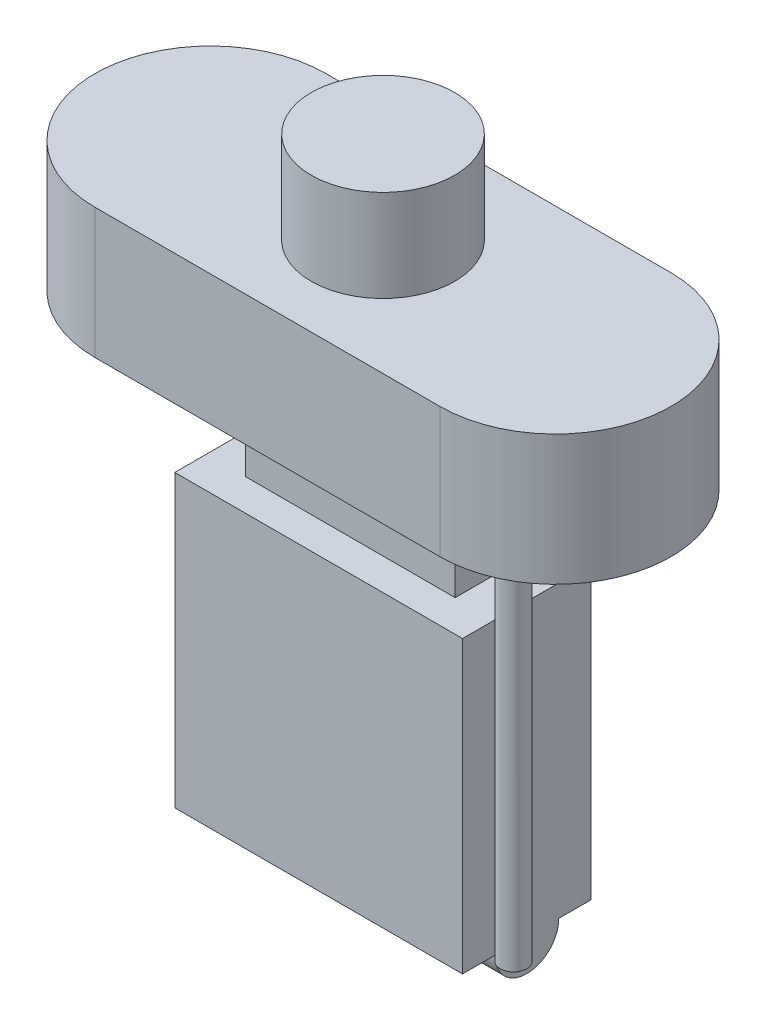
ISO-10303-21;
HEADER;
FILE_DESCRIPTION(('STEP AP214'),'2;1');
FILE_NAME('part.step','',(''),(''),'','','');
FILE_SCHEMA(('AUTOMOTIVE_DESIGN { 1 0 10303 214 1 1 1 1 }'));
ENDSEC;
DATA;
#1=APPLICATION_CONTEXT('core data for automotive mechanical design processes');
#2=APPLICATION_PROTOCOL_DEFINITION('international standard','automotive_design',2000,#1);
#3=PRODUCT_CONTEXT('',#1,'mechanical');
#4=PRODUCT('Part','Part','',(#3));
#5=PRODUCT_RELATED_PRODUCT_CATEGORY('part','',(#4));
#6=PRODUCT_DEFINITION_FORMATION('','',#4);
#7=PRODUCT_DEFINITION_CONTEXT('part definition',#1,'design');
#8=PRODUCT_DEFINITION('design','',#6,#7);
#9=PRODUCT_DEFINITION_SHAPE('','',#8);
#10=(LENGTH_UNIT() NAMED_UNIT(*) SI_UNIT(.MILLI.,.METRE.));
#11=(NAMED_UNIT(*) PLANE_ANGLE_UNIT() SI_UNIT($,.RADIAN.));
#12=(NAMED_UNIT(*) SI_UNIT($,.STERADIAN.) SOLID_ANGLE_UNIT());
#13=UNCERTAINTY_MEASURE_WITH_UNIT(LENGTH_MEASURE(1.E-05),#10,'distance_accuracy_value','');
#14=(GEOMETRIC_REPRESENTATION_CONTEXT(3) GLOBAL_UNCERTAINTY_ASSIGNED_CONTEXT((#13)) GLOBAL_UNIT_ASSIGNED_CONTEXT((#10,
#11,#12)) REPRESENTATION_CONTEXT('',''));
#15=CARTESIAN_POINT('',(0.,0.,0.));
#16=DIRECTION('',(0.,0.,1.));
#17=DIRECTION('',(1.,0.,0.));
#18=AXIS2_PLACEMENT_3D('',#15,#16,#17);
#19=CARTESIAN_POINT('',(0.,-64.4398,0.));
#20=DIRECTION('',(0.,1.,0.));
#21=DIRECTION('',(0.,0.,1.));
#22=AXIS2_PLACEMENT_3D('',#19,#20,#21);
#23=PLANE('',#22);
#24=DIRECTION('',(0.,0.,-1.));
#25=VECTOR('',#24,1.);
#26=CARTESIAN_POINT('',(-19.8755,-64.4398,-8.89));
#27=LINE('',#26,#25);
#28=CARTESIAN_POINT('',(-19.8755,-64.4398,8.89));
#29=VERTEX_POINT('',#28);
#30=CARTESIAN_POINT('',(-19.8755,-64.4398,4.4069));
#31=VERTEX_POINT('',#30);
#32=EDGE_CURVE('E55',#29,#31,#27,.T.);
#33=ORIENTED_EDGE('',*,*,#32,.T.);
#34=DIRECTION('',(1.,0.,0.));
#35=VECTOR('',#34,1.);
#36=CARTESIAN_POINT('',(-32.340095496044,-64.4398,4.4069));
#37=LINE('',#36,#35);
#38=CARTESIAN_POINT('',(19.8755,-64.4398,4.4069));
#39=VERTEX_POINT('',#38);
#40=EDGE_CURVE('E48',#31,#39,#37,.T.);
#41=ORIENTED_EDGE('',*,*,#40,.T.);
#42=DIRECTION('',(0.,0.,1.));
#43=VECTOR('',#42,1.);
#44=CARTESIAN_POINT('',(19.8755,-64.4398,-8.89));
#45=LINE('',#44,#43);
#46=CARTESIAN_POINT('',(19.8755,-64.4398,8.89));
#47=VERTEX_POINT('',#46);
#48=EDGE_CURVE('E213',#39,#47,#45,.T.);
#49=ORIENTED_EDGE('',*,*,#48,.T.);
#50=DIRECTION('',(-1.,0.,0.));
#51=VECTOR('',#50,1.);
#52=CARTESIAN_POINT('',(-19.8755,-64.4398,8.89));
#53=LINE('',#52,#51);
#54=EDGE_CURVE('E184',#47,#29,#53,.T.);
#55=ORIENTED_EDGE('',*,*,#54,.T.);
#56=EDGE_LOOP('',(#33,#41,#49,#55));
#57=FACE_BOUND('',#56,.T.);
#58=ADVANCED_FACE('F39',(#57),#23,.F.);
#59=CARTESIAN_POINT('',(-23.8379,-8.9916,0.));
#60=DIRECTION('',(0.,1.,0.));
#61=DIRECTION('',(0.,0.,1.));
#62=AXIS2_PLACEMENT_3D('',#59,#60,#61);
#63=PLANE('',#62);
#64=CARTESIAN_POINT('',(26.5130637037773,-8.9916,8.49181134207056));
#65=DIRECTION('',(0.,1.,0.));
#66=DIRECTION('',(0.,0.,1.));
#67=AXIS2_PLACEMENT_3D('',#64,#65,#66);
#68=CIRCLE('',#67,1.825);
#69=CARTESIAN_POINT('',(26.5130637037773,-8.9916,10.3168113420706));
#70=VERTEX_POINT('',#69);
#71=EDGE_CURVE('E11',#70,#70,#68,.F.);
#72=ORIENTED_EDGE('',*,*,#71,.F.);
#73=EDGE_LOOP('',(#72));
#74=FACE_BOUND('',#73,.T.);
#75=DIRECTION('',(-1.,0.,0.));
#76=VECTOR('',#75,1.);
#77=CARTESIAN_POINT('',(10.795,-8.9916,12.065));
#78=LINE('',#77,#76);
#79=CARTESIAN_POINT('',(-10.795,-8.9916,12.065));
#80=VERTEX_POINT('',#79);
#81=CARTESIAN_POINT('',(10.795,-8.9916,12.065));
#82=VERTEX_POINT('',#81);
#83=EDGE_CURVE('E375',#80,#82,#78,.F.);
#84=ORIENTED_EDGE('',*,*,#83,.T.);
#85=CARTESIAN_POINT('',(10.795,-8.9916,0.));
#86=DIRECTION('',(0.,1.,0.));
#87=DIRECTION('',(0.,0.,1.));
#88=AXIS2_PLACEMENT_3D('',#85,#86,#87);
#89=CIRCLE('',#88,12.065);
#90=CARTESIAN_POINT('',(10.795,-8.9916,-12.065));
#91=VERTEX_POINT('',#90);
#92=EDGE_CURVE('E384',#82,#91,#89,.T.);
#93=ORIENTED_EDGE('',*,*,#92,.T.);
#94=DIRECTION('',(1.,0.,0.));
#95=VECTOR('',#94,1.);
#96=CARTESIAN_POINT('',(-10.795,-8.9916,-12.065));
#97=LINE('',#96,#95);
#98=CARTESIAN_POINT('',(-10.795,-8.9916,-12.065));
#99=VERTEX_POINT('',#98);
#100=EDGE_CURVE('E381',#91,#99,#97,.F.);
#101=ORIENTED_EDGE('',*,*,#100,.T.);
#102=CARTESIAN_POINT('',(-10.795,-8.9916,0.));
#103=DIRECTION('',(0.,1.,0.));
#104=DIRECTION('',(0.,0.,1.));
#105=AXIS2_PLACEMENT_3D('',#102,#103,#104);
#106=CIRCLE('',#105,12.065);
#107=EDGE_CURVE('E378',#99,#80,#106,.T.);
#108=ORIENTED_EDGE('',*,*,#107,.T.);
#109=EDGE_LOOP('',(#84,#93,#101,#108));
#110=FACE_BOUND('',#109,.T.);
#111=CARTESIAN_POINT('',(-23.8379,-8.9916,0.));
#112=DIRECTION('',(0.,1.,0.));
#113=DIRECTION('',(0.,0.,1.));
#114=AXIS2_PLACEMENT_3D('',#111,#112,#113);
#115=CIRCLE('',#114,15.9766);
#116=CARTESIAN_POINT('',(-23.8379,-8.9916,-15.9766));
#117=VERTEX_POINT('',#116);
#118=CARTESIAN_POINT('',(-23.8379,-8.9916,15.9766));
#119=VERTEX_POINT('',#118);
#120=EDGE_CURVE('E325',#117,#119,#115,.T.);
#121=ORIENTED_EDGE('',*,*,#120,.F.);
#122=DIRECTION('',(-1.,0.,0.));
#123=VECTOR('',#122,1.);
#124=CARTESIAN_POINT('',(-23.8379,-8.9916,-15.9766));
#125=LINE('',#124,#123);
#126=CARTESIAN_POINT('',(23.8379,-8.9916,-15.9766));
#127=VERTEX_POINT('',#126);
#128=EDGE_CURVE('E337',#127,#117,#125,.T.);
#129=ORIENTED_EDGE('',*,*,#128,.F.);
#130=CARTESIAN_POINT('',(23.8379,-8.9916,0.));
#131=DIRECTION('',(0.,1.,0.));
#132=DIRECTION('',(0.,0.,1.));
#133=AXIS2_PLACEMENT_3D('',#130,#131,#132);
#134=CIRCLE('',#133,15.9766);
#135=CARTESIAN_POINT('',(23.8379,-8.9916,15.9766));
#136=VERTEX_POINT('',#135);
#137=EDGE_CURVE('E353',#136,#127,#134,.T.);
#138=ORIENTED_EDGE('',*,*,#137,.F.);
#139=DIRECTION('',(1.,0.,0.));
#140=VECTOR('',#139,1.);
#141=CARTESIAN_POINT('',(-23.8379,-8.9916,15.9766));
#142=LINE('',#141,#140);
#143=EDGE_CURVE('E350',#119,#136,#142,.T.);
#144=ORIENTED_EDGE('',*,*,#143,.F.);
#145=EDGE_LOOP('',(#121,#129,#138,#144));
#146=FACE_BOUND('',#145,.T.);
#147=ADVANCED_FACE('F436',(#74,#110,#146),#63,.F.);
#148=CARTESIAN_POINT('',(-23.8379,8.9916,0.));
#149=DIRECTION('',(0.,-1.,0.));
#150=DIRECTION('',(0.,0.,-1.));
#151=AXIS2_PLACEMENT_3D('',#148,#149,#150);
#152=CYLINDRICAL_SURFACE('',#151,15.9766);
#153=ORIENTED_EDGE('',*,*,#120,.T.);
#154=DIRECTION('',(0.,-1.,0.));
#155=VECTOR('',#154,1.);
#156=CARTESIAN_POINT('',(-23.8379,8.9916,15.9766));
#157=LINE('',#156,#155);
#158=CARTESIAN_POINT('',(-23.8379,8.9916,15.9766));
#159=VERTEX_POINT('',#158);
#160=EDGE_CURVE('E331',#159,#119,#157,.T.);
#161=ORIENTED_EDGE('',*,*,#160,.F.);
#162=CARTESIAN_POINT('',(-23.8379,8.9916,0.));
#163=DIRECTION('',(0.,1.,0.));
#164=DIRECTION('',(0.,0.,1.));
#165=AXIS2_PLACEMENT_3D('',#162,#163,#164);
#166=CIRCLE('',#165,15.9766);
#167=CARTESIAN_POINT('',(-23.8379,8.9916,-15.9766));
#168=VERTEX_POINT('',#167);
#169=EDGE_CURVE('E332',#168,#159,#166,.T.);
#170=ORIENTED_EDGE('',*,*,#169,.F.);
#171=DIRECTION('',(0.,-1.,0.));
#172=VECTOR('',#171,1.);
#173=CARTESIAN_POINT('',(-23.8379,8.9916,-15.9766));
#174=LINE('',#173,#172);
#175=EDGE_CURVE('E346',#168,#117,#174,.T.);
#176=ORIENTED_EDGE('',*,*,#175,.T.);
#177=EDGE_LOOP('',(#153,#161,#170,#176));
#178=FACE_BOUND('',#177,.T.);
#179=ADVANCED_FACE('F440',(#178),#152,.T.);
#180=CARTESIAN_POINT('',(-23.8379,8.9916,15.9766));
#181=DIRECTION('',(0.,0.,-1.));
#182=DIRECTION('',(-1.,0.,0.));
#183=AXIS2_PLACEMENT_3D('',#180,#181,#182);
#184=PLANE('',#183);
#185=ORIENTED_EDGE('',*,*,#143,.T.);
#186=DIRECTION('',(0.,-1.,0.));
#187=VECTOR('',#186,1.);
#188=CARTESIAN_POINT('',(23.8379,8.9916,15.9766));
#189=LINE('',#188,#187);
#190=CARTESIAN_POINT('',(23.8379,8.9916,15.9766));
#191=VERTEX_POINT('',#190);
#192=EDGE_CURVE('E365',#191,#136,#189,.T.);
#193=ORIENTED_EDGE('',*,*,#192,.F.);
#194=DIRECTION('',(1.,0.,0.));
#195=VECTOR('',#194,1.);
#196=CARTESIAN_POINT('',(-23.8379,8.9916,15.9766));
#197=LINE('',#196,#195);
#198=EDGE_CURVE('E336',#159,#191,#197,.T.);
#199=ORIENTED_EDGE('',*,*,#198,.F.);
#200=ORIENTED_EDGE('',*,*,#160,.T.);
#201=EDGE_LOOP('',(#185,#193,#199,#200));
#202=FACE_BOUND('',#201,.T.);
#203=ADVANCED_FACE('F520',(#202),#184,.F.);
#204=CARTESIAN_POINT('',(23.8379,8.9916,0.));
#205=DIRECTION('',(0.,-1.,0.));
#206=DIRECTION('',(0.,0.,-1.));
#207=AXIS2_PLACEMENT_3D('',#204,#205,#206);
#208=CYLINDRICAL_SURFACE('',#207,15.9766);
#209=ORIENTED_EDGE('',*,*,#137,.T.);
#210=DIRECTION('',(0.,-1.,0.));
#211=VECTOR('',#210,1.);
#212=CARTESIAN_POINT('',(23.8379,8.9916,-15.9766));
#213=LINE('',#212,#211);
#214=CARTESIAN_POINT('',(23.8379,8.9916,-15.9766));
#215=VERTEX_POINT('',#214);
#216=EDGE_CURVE('E361',#215,#127,#213,.T.);
#217=ORIENTED_EDGE('',*,*,#216,.F.);
#218=CARTESIAN_POINT('',(23.8379,8.9916,0.));
#219=DIRECTION('',(0.,1.,0.));
#220=DIRECTION('',(0.,0.,1.));
#221=AXIS2_PLACEMENT_3D('',#218,#219,#220);
#222=CIRCLE('',#221,15.9766);
#223=EDGE_CURVE('E340',#191,#215,#222,.T.);
#224=ORIENTED_EDGE('',*,*,#223,.F.);
#225=ORIENTED_EDGE('',*,*,#192,.T.);
#226=EDGE_LOOP('',(#209,#217,#224,#225));
#227=FACE_BOUND('',#226,.T.);
#228=ADVANCED_FACE('F517',(#227),#208,.T.);
#229=CARTESIAN_POINT('',(-23.8379,8.9916,-15.9766));
#230=DIRECTION('',(0.,0.,1.));
#231=DIRECTION('',(1.,0.,0.));
#232=AXIS2_PLACEMENT_3D('',#229,#230,#231);
#233=PLANE('',#232);
#234=ORIENTED_EDGE('',*,*,#128,.T.);
#235=ORIENTED_EDGE('',*,*,#175,.F.);
#236=DIRECTION('',(-1.,0.,0.));
#237=VECTOR('',#236,1.);
#238=CARTESIAN_POINT('',(-23.8379,8.9916,-15.9766));
#239=LINE('',#238,#237);
#240=EDGE_CURVE('E343',#215,#168,#239,.T.);
#241=ORIENTED_EDGE('',*,*,#240,.F.);
#242=ORIENTED_EDGE('',*,*,#216,.T.);
#243=EDGE_LOOP('',(#234,#235,#241,#242));
#244=FACE_BOUND('',#243,.T.);
#245=ADVANCED_FACE('F513',(#244),#233,.F.);
#246=CARTESIAN_POINT('',(-23.8379,8.9916,0.));
#247=DIRECTION('',(0.,1.,0.));
#248=DIRECTION('',(0.,0.,1.));
#249=AXIS2_PLACEMENT_3D('',#246,#247,#248);
#250=PLANE('',#249);
#251=CARTESIAN_POINT('',(0.,8.9916,0.));
#252=DIRECTION('',(0.,1.,0.));
#253=DIRECTION('',(0.,0.,1.));
#254=AXIS2_PLACEMENT_3D('',#251,#252,#253);
#255=CIRCLE('',#254,9.906);
#256=CARTESIAN_POINT('',(0.,8.9916,9.906));
#257=VERTEX_POINT('',#256);
#258=EDGE_CURVE('E326',#257,#257,#255,.T.);
#259=ORIENTED_EDGE('',*,*,#258,.F.);
#260=EDGE_LOOP('',(#259));
#261=FACE_BOUND('',#260,.T.);
#262=ORIENTED_EDGE('',*,*,#169,.T.);
#263=ORIENTED_EDGE('',*,*,#198,.T.);
#264=ORIENTED_EDGE('',*,*,#223,.T.);
#265=ORIENTED_EDGE('',*,*,#240,.T.);
#266=EDGE_LOOP('',(#262,#263,#264,#265));
#267=FACE_BOUND('',#266,.T.);
#268=ADVANCED_FACE('F522',(#261,#267),#250,.T.);
#269=CARTESIAN_POINT('',(0.,21.6916,0.));
#270=DIRECTION('',(0.,-1.,0.));
#271=DIRECTION('',(0.,0.,-1.));
#272=AXIS2_PLACEMENT_3D('',#269,#270,#271);
#273=CYLINDRICAL_SURFACE('',#272,9.906);
#274=CARTESIAN_POINT('',(0.,21.6916,0.));
#275=DIRECTION('',(0.,1.,0.));
#276=DIRECTION('',(0.,0.,1.));
#277=AXIS2_PLACEMENT_3D('',#274,#275,#276);
#278=CIRCLE('',#277,9.906);
#279=CARTESIAN_POINT('',(0.,21.6916,9.906));
#280=VERTEX_POINT('',#279);
#281=EDGE_CURVE('E321',#280,#280,#278,.T.);
#282=ORIENTED_EDGE('',*,*,#281,.F.);
#283=EDGE_LOOP('',(#282));
#284=FACE_BOUND('',#283,.T.);
#285=ORIENTED_EDGE('',*,*,#258,.T.);
#286=EDGE_LOOP('',(#285));
#287=FACE_BOUND('',#286,.T.);
#288=ADVANCED_FACE('F524',(#284,#287),#273,.T.);
#289=CARTESIAN_POINT('',(0.,21.6916,0.));
#290=DIRECTION('',(0.,1.,0.));
#291=DIRECTION('',(0.,0.,1.));
#292=AXIS2_PLACEMENT_3D('',#289,#290,#291);
#293=PLANE('',#292);
#294=ORIENTED_EDGE('',*,*,#281,.T.);
#295=EDGE_LOOP('',(#294));
#296=FACE_BOUND('',#295,.T.);
#297=ADVANCED_FACE('F531',(#296),#293,.T.);
#298=CARTESIAN_POINT('',(-10.795,-15.0876,0.));
#299=DIRECTION('',(0.,1.,0.));
#300=DIRECTION('',(0.,0.,1.));
#301=AXIS2_PLACEMENT_3D('',#298,#299,#300);
#302=CYLINDRICAL_SURFACE('',#301,9.525);
#303=DIRECTION('',(0.,1.,0.));
#304=VECTOR('',#303,1.);
#305=CARTESIAN_POINT('',(-10.795,-15.0876,9.525));
#306=LINE('',#305,#304);
#307=CARTESIAN_POINT('',(-10.795,-15.0876,9.525));
#308=VERTEX_POINT('',#307);
#309=CARTESIAN_POINT('',(-10.795,-11.5316,9.525));
#310=VERTEX_POINT('',#309);
#311=EDGE_CURVE('E305',#308,#310,#306,.T.);
#312=ORIENTED_EDGE('',*,*,#311,.T.);
#313=CARTESIAN_POINT('',(-10.795,-11.5316,0.));
#314=DIRECTION('',(0.,1.,0.));
#315=DIRECTION('',(0.,0.,1.));
#316=AXIS2_PLACEMENT_3D('',#313,#314,#315);
#317=CIRCLE('',#316,9.525);
#318=CARTESIAN_POINT('',(-10.795,-11.5316,-9.525));
#319=VERTEX_POINT('',#318);
#320=EDGE_CURVE('E391',#310,#319,#317,.F.);
#321=ORIENTED_EDGE('',*,*,#320,.T.);
#322=DIRECTION('',(0.,1.,0.));
#323=VECTOR('',#322,1.);
#324=CARTESIAN_POINT('',(-10.795,-15.0876,-9.525));
#325=LINE('',#324,#323);
#326=CARTESIAN_POINT('',(-10.795,-15.0876,-9.525));
#327=VERTEX_POINT('',#326);
#328=EDGE_CURVE('E317',#327,#319,#325,.T.);
#329=ORIENTED_EDGE('',*,*,#328,.F.);
#330=CARTESIAN_POINT('',(-10.795,-15.0876,0.));
#331=DIRECTION('',(0.,-1.,0.));
#332=DIRECTION('',(0.,0.,-1.));
#333=AXIS2_PLACEMENT_3D('',#330,#331,#332);
#334=CIRCLE('',#333,9.525);
#335=EDGE_CURVE('E291',#308,#327,#334,.T.);
#336=ORIENTED_EDGE('',*,*,#335,.F.);
#337=EDGE_LOOP('',(#312,#321,#329,#336));
#338=FACE_BOUND('',#337,.T.);
#339=ADVANCED_FACE('F475',(#338),#302,.T.);
#340=CARTESIAN_POINT('',(-10.795,-15.0876,-9.525));
#341=DIRECTION('',(0.,0.,1.));
#342=DIRECTION('',(1.,0.,0.));
#343=AXIS2_PLACEMENT_3D('',#340,#341,#342);
#344=PLANE('',#343);
#345=ORIENTED_EDGE('',*,*,#328,.T.);
#346=DIRECTION('',(1.,0.,0.));
#347=VECTOR('',#346,1.);
#348=CARTESIAN_POINT('',(10.795,-11.5316,-9.525));
#349=LINE('',#348,#347);
#350=CARTESIAN_POINT('',(10.795,-11.5316,-9.525));
#351=VERTEX_POINT('',#350);
#352=EDGE_CURVE('E388',#319,#351,#349,.T.);
#353=ORIENTED_EDGE('',*,*,#352,.T.);
#354=DIRECTION('',(0.,1.,0.));
#355=VECTOR('',#354,1.);
#356=CARTESIAN_POINT('',(10.795,-15.0876,-9.525));
#357=LINE('',#356,#355);
#358=CARTESIAN_POINT('',(10.795,-15.0876,-9.525));
#359=VERTEX_POINT('',#358);
#360=EDGE_CURVE('E313',#359,#351,#357,.T.);
#361=ORIENTED_EDGE('',*,*,#360,.F.);
#362=DIRECTION('',(1.,0.,0.));
#363=VECTOR('',#362,1.);
#364=CARTESIAN_POINT('',(-10.795,-15.0876,-9.525));
#365=LINE('',#364,#363);
#366=EDGE_CURVE('E295',#327,#359,#365,.T.);
#367=ORIENTED_EDGE('',*,*,#366,.F.);
#368=EDGE_LOOP('',(#345,#353,#361,#367));
#369=FACE_BOUND('',#368,.T.);
#370=ADVANCED_FACE('F479',(#369),#344,.F.);
#371=CARTESIAN_POINT('',(10.795,-15.0876,0.));
#372=DIRECTION('',(0.,1.,0.));
#373=DIRECTION('',(0.,0.,1.));
#374=AXIS2_PLACEMENT_3D('',#371,#372,#373);
#375=CYLINDRICAL_SURFACE('',#374,9.525);
#376=ORIENTED_EDGE('',*,*,#360,.T.);
#377=CARTESIAN_POINT('',(10.795,-11.5316,0.));
#378=DIRECTION('',(0.,1.,0.));
#379=DIRECTION('',(0.,0.,1.));
#380=AXIS2_PLACEMENT_3D('',#377,#378,#379);
#381=CIRCLE('',#380,9.525);
#382=CARTESIAN_POINT('',(10.795,-11.5316,9.525));
#383=VERTEX_POINT('',#382);
#384=EDGE_CURVE('E330',#351,#383,#381,.F.);
#385=ORIENTED_EDGE('',*,*,#384,.T.);
#386=DIRECTION('',(0.,1.,0.));
#387=VECTOR('',#386,1.);
#388=CARTESIAN_POINT('',(10.795,-15.0876,9.525));
#389=LINE('',#388,#387);
#390=CARTESIAN_POINT('',(10.795,-15.0876,9.525));
#391=VERTEX_POINT('',#390);
#392=EDGE_CURVE('E309',#391,#383,#389,.T.);
#393=ORIENTED_EDGE('',*,*,#392,.F.);
#394=CARTESIAN_POINT('',(10.795,-15.0876,0.));
#395=DIRECTION('',(0.,-1.,0.));
#396=DIRECTION('',(0.,0.,-1.));
#397=AXIS2_PLACEMENT_3D('',#394,#395,#396);
#398=CIRCLE('',#397,9.525);
#399=EDGE_CURVE('E299',#359,#391,#398,.T.);
#400=ORIENTED_EDGE('',*,*,#399,.F.);
#401=EDGE_LOOP('',(#376,#385,#393,#400));
#402=FACE_BOUND('',#401,.T.);
#403=ADVANCED_FACE('F496',(#402),#375,.T.);
#404=CARTESIAN_POINT('',(-10.795,-15.0876,9.525));
#405=DIRECTION('',(0.,0.,-1.));
#406=DIRECTION('',(-1.,0.,0.));
#407=AXIS2_PLACEMENT_3D('',#404,#405,#406);
#408=PLANE('',#407);
#409=ORIENTED_EDGE('',*,*,#392,.T.);
#410=DIRECTION('',(-1.,0.,0.));
#411=VECTOR('',#410,1.);
#412=CARTESIAN_POINT('',(-10.795,-11.5316,9.525));
#413=LINE('',#412,#411);
#414=EDGE_CURVE('E195',#383,#310,#413,.T.);
#415=ORIENTED_EDGE('',*,*,#414,.T.);
#416=ORIENTED_EDGE('',*,*,#311,.F.);
#417=DIRECTION('',(-1.,0.,0.));
#418=VECTOR('',#417,1.);
#419=CARTESIAN_POINT('',(-10.795,-15.0876,9.525));
#420=LINE('',#419,#418);
#421=EDGE_CURVE('E302',#391,#308,#420,.T.);
#422=ORIENTED_EDGE('',*,*,#421,.F.);
#423=EDGE_LOOP('',(#409,#415,#416,#422));
#424=FACE_BOUND('',#423,.T.);
#425=ADVANCED_FACE('F467',(#424),#408,.F.);
#426=CARTESIAN_POINT('',(-10.795,-15.0876,0.));
#427=DIRECTION('',(0.,-1.,0.));
#428=DIRECTION('',(0.,0.,-1.));
#429=AXIS2_PLACEMENT_3D('',#426,#427,#428);
#430=PLANE('',#429);
#431=DIRECTION('',(0.,0.,1.));
#432=VECTOR('',#431,1.);
#433=CARTESIAN_POINT('',(14.478,-15.0876,-4.5085));
#434=LINE('',#433,#432);
#435=CARTESIAN_POINT('',(14.478,-15.0876,-4.5085));
#436=VERTEX_POINT('',#435);
#437=CARTESIAN_POINT('',(14.478,-15.0876,4.5085));
#438=VERTEX_POINT('',#437);
#439=EDGE_CURVE('E242',#436,#438,#434,.T.);
#440=ORIENTED_EDGE('',*,*,#439,.F.);
#441=DIRECTION('',(1.,0.,0.));
#442=VECTOR('',#441,1.);
#443=CARTESIAN_POINT('',(-14.478,-15.0876,-4.5085));
#444=LINE('',#443,#442);
#445=CARTESIAN_POINT('',(-14.478,-15.0876,-4.5085));
#446=VERTEX_POINT('',#445);
#447=EDGE_CURVE('E248',#446,#436,#444,.T.);
#448=ORIENTED_EDGE('',*,*,#447,.F.);
#449=DIRECTION('',(0.,0.,-1.));
#450=VECTOR('',#449,1.);
#451=CARTESIAN_POINT('',(-14.478,-15.0876,-4.5085));
#452=LINE('',#451,#450);
#453=CARTESIAN_POINT('',(-14.478,-15.0876,4.5085));
#454=VERTEX_POINT('',#453);
#455=EDGE_CURVE('E268',#454,#446,#452,.T.);
#456=ORIENTED_EDGE('',*,*,#455,.F.);
#457=DIRECTION('',(-1.,0.,0.));
#458=VECTOR('',#457,1.);
#459=CARTESIAN_POINT('',(-14.478,-15.0876,4.5085));
#460=LINE('',#459,#458);
#461=EDGE_CURVE('E264',#438,#454,#460,.T.);
#462=ORIENTED_EDGE('',*,*,#461,.F.);
#463=EDGE_LOOP('',(#440,#448,#456,#462));
#464=FACE_BOUND('',#463,.T.);
#465=ORIENTED_EDGE('',*,*,#335,.T.);
#466=ORIENTED_EDGE('',*,*,#366,.T.);
#467=ORIENTED_EDGE('',*,*,#399,.T.);
#468=ORIENTED_EDGE('',*,*,#421,.T.);
#469=EDGE_LOOP('',(#465,#466,#467,#468));
#470=FACE_BOUND('',#469,.T.);
#471=ADVANCED_FACE('F464',(#464,#470),#430,.T.);
#472=CARTESIAN_POINT('',(-10.795,-11.5316,0.));
#473=DIRECTION('',(0.,1.,0.));
#474=DIRECTION('',(0.,0.,1.));
#475=AXIS2_PLACEMENT_3D('',#472,#473,#474);
#476=TOROIDAL_SURFACE('',#475,12.065,2.54);
#477=CARTESIAN_POINT('',(-10.795,-11.5316,12.065));
#478=DIRECTION('',(-1.,0.,0.));
#479=DIRECTION('',(0.,0.,1.));
#480=AXIS2_PLACEMENT_3D('',#477,#478,#479);
#481=CIRCLE('',#480,2.54);
#482=EDGE_CURVE('E401',#80,#310,#481,.T.);
#483=ORIENTED_EDGE('',*,*,#482,.F.);
#484=ORIENTED_EDGE('',*,*,#107,.F.);
#485=CARTESIAN_POINT('',(-10.795,-11.5316,-12.065));
#486=DIRECTION('',(-1.,0.,0.));
#487=DIRECTION('',(0.,0.,1.));
#488=AXIS2_PLACEMENT_3D('',#485,#486,#487);
#489=CIRCLE('',#488,2.54);
#490=EDGE_CURVE('E296',#319,#99,#489,.T.);
#491=ORIENTED_EDGE('',*,*,#490,.F.);
#492=ORIENTED_EDGE('',*,*,#320,.F.);
#493=EDGE_LOOP('',(#483,#484,#491,#492));
#494=FACE_BOUND('',#493,.T.);
#495=ADVANCED_FACE('F41',(#494),#476,.F.);
#496=CARTESIAN_POINT('',(-10.795,-11.5316,-12.065));
#497=DIRECTION('',(-1.,0.,0.));
#498=DIRECTION('',(0.,0.,1.));
#499=AXIS2_PLACEMENT_3D('',#496,#497,#498);
#500=CYLINDRICAL_SURFACE('',#499,2.54);
#501=ORIENTED_EDGE('',*,*,#490,.T.);
#502=ORIENTED_EDGE('',*,*,#100,.F.);
#503=CARTESIAN_POINT('',(10.795,-11.5316,-12.065));
#504=DIRECTION('',(-1.,0.,0.));
#505=DIRECTION('',(0.,0.,1.));
#506=AXIS2_PLACEMENT_3D('',#503,#504,#505);
#507=CIRCLE('',#506,2.54);
#508=EDGE_CURVE('E398',#351,#91,#507,.T.);
#509=ORIENTED_EDGE('',*,*,#508,.F.);
#510=ORIENTED_EDGE('',*,*,#352,.F.);
#511=EDGE_LOOP('',(#501,#502,#509,#510));
#512=FACE_BOUND('',#511,.T.);
#513=ADVANCED_FACE('F487',(#512),#500,.F.);
#514=CARTESIAN_POINT('',(-10.795,-11.5316,12.065));
#515=DIRECTION('',(1.,0.,0.));
#516=DIRECTION('',(0.,0.,-1.));
#517=AXIS2_PLACEMENT_3D('',#514,#515,#516);
#518=CYLINDRICAL_SURFACE('',#517,2.54);
#519=ORIENTED_EDGE('',*,*,#482,.T.);
#520=ORIENTED_EDGE('',*,*,#414,.F.);
#521=CARTESIAN_POINT('',(10.795,-11.5316,12.065));
#522=DIRECTION('',(-1.,0.,0.));
#523=DIRECTION('',(0.,0.,1.));
#524=AXIS2_PLACEMENT_3D('',#521,#522,#523);
#525=CIRCLE('',#524,2.54);
#526=EDGE_CURVE('E290',#82,#383,#525,.T.);
#527=ORIENTED_EDGE('',*,*,#526,.F.);
#528=ORIENTED_EDGE('',*,*,#83,.F.);
#529=EDGE_LOOP('',(#519,#520,#527,#528));
#530=FACE_BOUND('',#529,.T.);
#531=ADVANCED_FACE('F500',(#530),#518,.F.);
#532=CARTESIAN_POINT('',(10.795,-11.5316,0.));
#533=DIRECTION('',(0.,1.,0.));
#534=DIRECTION('',(0.,0.,1.));
#535=AXIS2_PLACEMENT_3D('',#532,#533,#534);
#536=TOROIDAL_SURFACE('',#535,12.065,2.54);
#537=ORIENTED_EDGE('',*,*,#508,.T.);
#538=ORIENTED_EDGE('',*,*,#92,.F.);
#539=ORIENTED_EDGE('',*,*,#526,.T.);
#540=ORIENTED_EDGE('',*,*,#384,.F.);
#541=EDGE_LOOP('',(#537,#538,#539,#540));
#542=FACE_BOUND('',#541,.T.);
#543=ADVANCED_FACE('F491',(#542),#536,.F.);
#544=CARTESIAN_POINT('',(14.478,-24.3078,-4.5085));
#545=DIRECTION('',(-1.,0.,0.));
#546=DIRECTION('',(0.,0.,1.));
#547=AXIS2_PLACEMENT_3D('',#544,#545,#546);
#548=PLANE('',#547);
#549=ORIENTED_EDGE('',*,*,#439,.T.);
#550=DIRECTION('',(0.,1.,0.));
#551=VECTOR('',#550,1.);
#552=CARTESIAN_POINT('',(14.478,-24.3078,4.5085));
#553=LINE('',#552,#551);
#554=CARTESIAN_POINT('',(14.478,-24.3078,4.5085));
#555=VERTEX_POINT('',#554);
#556=EDGE_CURVE('E286',#555,#438,#553,.T.);
#557=ORIENTED_EDGE('',*,*,#556,.F.);
#558=DIRECTION('',(0.,0.,1.));
#559=VECTOR('',#558,1.);
#560=CARTESIAN_POINT('',(14.478,-24.3078,-4.5085));
#561=LINE('',#560,#559);
#562=CARTESIAN_POINT('',(14.478,-24.3078,-4.5085));
#563=VERTEX_POINT('',#562);
#564=EDGE_CURVE('E243',#563,#555,#561,.T.);
#565=ORIENTED_EDGE('',*,*,#564,.F.);
#566=DIRECTION('',(0.,1.,0.));
#567=VECTOR('',#566,1.);
#568=CARTESIAN_POINT('',(14.478,-24.3078,-4.5085));
#569=LINE('',#568,#567);
#570=EDGE_CURVE('E260',#563,#436,#569,.T.);
#571=ORIENTED_EDGE('',*,*,#570,.T.);
#572=EDGE_LOOP('',(#549,#557,#565,#571));
#573=FACE_BOUND('',#572,.T.);
#574=ADVANCED_FACE('F457',(#573),#548,.F.);
#575=CARTESIAN_POINT('',(-14.478,-24.3078,4.5085));
#576=DIRECTION('',(0.,0.,-1.));
#577=DIRECTION('',(-1.,0.,0.));
#578=AXIS2_PLACEMENT_3D('',#575,#576,#577);
#579=PLANE('',#578);
#580=ORIENTED_EDGE('',*,*,#461,.T.);
#581=DIRECTION('',(0.,1.,0.));
#582=VECTOR('',#581,1.);
#583=CARTESIAN_POINT('',(-14.478,-24.3078,4.5085));
#584=LINE('',#583,#582);
#585=CARTESIAN_POINT('',(-14.478,-24.3078,4.5085));
#586=VERTEX_POINT('',#585);
#587=EDGE_CURVE('E282',#586,#454,#584,.T.);
#588=ORIENTED_EDGE('',*,*,#587,.F.);
#589=DIRECTION('',(-1.,0.,0.));
#590=VECTOR('',#589,1.);
#591=CARTESIAN_POINT('',(-14.478,-24.3078,4.5085));
#592=LINE('',#591,#590);
#593=EDGE_CURVE('E247',#555,#586,#592,.T.);
#594=ORIENTED_EDGE('',*,*,#593,.F.);
#595=ORIENTED_EDGE('',*,*,#556,.T.);
#596=EDGE_LOOP('',(#580,#588,#594,#595));
#597=FACE_BOUND('',#596,.T.);
#598=ADVANCED_FACE('F460',(#597),#579,.F.);
#599=CARTESIAN_POINT('',(-14.478,-24.3078,-4.5085));
#600=DIRECTION('',(1.,0.,0.));
#601=DIRECTION('',(0.,0.,-1.));
#602=AXIS2_PLACEMENT_3D('',#599,#600,#601);
#603=PLANE('',#602);
#604=ORIENTED_EDGE('',*,*,#455,.T.);
#605=DIRECTION('',(0.,1.,0.));
#606=VECTOR('',#605,1.);
#607=CARTESIAN_POINT('',(-14.478,-24.3078,-4.5085));
#608=LINE('',#607,#606);
#609=CARTESIAN_POINT('',(-14.478,-24.3078,-4.5085));
#610=VERTEX_POINT('',#609);
#611=EDGE_CURVE('E278',#610,#446,#608,.T.);
#612=ORIENTED_EDGE('',*,*,#611,.F.);
#613=DIRECTION('',(0.,0.,-1.));
#614=VECTOR('',#613,1.);
#615=CARTESIAN_POINT('',(-14.478,-24.3078,-4.5085));
#616=LINE('',#615,#614);
#617=EDGE_CURVE('E252',#586,#610,#616,.T.);
#618=ORIENTED_EDGE('',*,*,#617,.F.);
#619=ORIENTED_EDGE('',*,*,#587,.T.);
#620=EDGE_LOOP('',(#604,#612,#618,#619));
#621=FACE_BOUND('',#620,.T.);
#622=ADVANCED_FACE('F462',(#621),#603,.F.);
#623=CARTESIAN_POINT('',(-14.478,-24.3078,-4.5085));
#624=DIRECTION('',(0.,0.,1.));
#625=DIRECTION('',(1.,0.,0.));
#626=AXIS2_PLACEMENT_3D('',#623,#624,#625);
#627=PLANE('',#626);
#628=ORIENTED_EDGE('',*,*,#447,.T.);
#629=ORIENTED_EDGE('',*,*,#570,.F.);
#630=DIRECTION('',(1.,0.,0.));
#631=VECTOR('',#630,1.);
#632=CARTESIAN_POINT('',(-14.478,-24.3078,-4.5085));
#633=LINE('',#632,#631);
#634=EDGE_CURVE('E256',#610,#563,#633,.T.);
#635=ORIENTED_EDGE('',*,*,#634,.F.);
#636=ORIENTED_EDGE('',*,*,#611,.T.);
#637=EDGE_LOOP('',(#628,#629,#635,#636));
#638=FACE_BOUND('',#637,.T.);
#639=ADVANCED_FACE('F455',(#638),#627,.F.);
#640=CARTESIAN_POINT('',(19.8755,-64.4398,-8.89));
#641=DIRECTION('',(-1.,0.,0.));
#642=DIRECTION('',(0.,0.,1.));
#643=AXIS2_PLACEMENT_3D('',#640,#641,#642);
#644=PLANE('',#643);
#645=ORIENTED_EDGE('',*,*,#48,.F.);
#646=CARTESIAN_POINT('',(19.8755,-64.4398,0.));
#647=DIRECTION('',(1.,0.,0.));
#648=DIRECTION('',(0.,0.,-1.));
#649=AXIS2_PLACEMENT_3D('',#646,#647,#648);
#650=CIRCLE('',#649,4.4069);
#651=CARTESIAN_POINT('',(19.8755,-64.4398,-4.4069));
#652=VERTEX_POINT('',#651);
#653=EDGE_CURVE('E200',#39,#652,#650,.T.);
#654=ORIENTED_EDGE('',*,*,#653,.T.);
#655=CARTESIAN_POINT('',(19.8755,-64.4398,-8.89));
#656=VERTEX_POINT('',#655);
#657=EDGE_CURVE('E190',#656,#652,#45,.T.);
#658=ORIENTED_EDGE('',*,*,#657,.F.);
#659=DIRECTION('',(0.,1.,0.));
#660=VECTOR('',#659,1.);
#661=CARTESIAN_POINT('',(19.8755,-64.4398,-8.89));
#662=LINE('',#661,#660);
#663=CARTESIAN_POINT('',(19.8755,-24.3078,-8.89));
#664=VERTEX_POINT('',#663);
#665=EDGE_CURVE('E219',#656,#664,#662,.T.);
#666=ORIENTED_EDGE('',*,*,#665,.T.);
#667=DIRECTION('',(0.,0.,1.));
#668=VECTOR('',#667,1.);
#669=CARTESIAN_POINT('',(19.8755,-24.3078,-8.89));
#670=LINE('',#669,#668);
#671=CARTESIAN_POINT('',(19.8755,-24.3078,8.89));
#672=VERTEX_POINT('',#671);
#673=EDGE_CURVE('E199',#664,#672,#670,.T.);
#674=ORIENTED_EDGE('',*,*,#673,.T.);
#675=DIRECTION('',(0.,1.,0.));
#676=VECTOR('',#675,1.);
#677=CARTESIAN_POINT('',(19.8755,-64.4398,8.89));
#678=LINE('',#677,#676);
#679=EDGE_CURVE('E238',#47,#672,#678,.T.);
#680=ORIENTED_EDGE('',*,*,#679,.F.);
#681=EDGE_LOOP('',(#645,#654,#658,#666,#674,#680));
#682=FACE_BOUND('',#681,.T.);
#683=ADVANCED_FACE('F415',(#682),#644,.F.);
#684=CARTESIAN_POINT('',(-19.8755,-64.4398,8.89));
#685=DIRECTION('',(0.,0.,-1.));
#686=DIRECTION('',(-1.,0.,0.));
#687=AXIS2_PLACEMENT_3D('',#684,#685,#686);
#688=PLANE('',#687);
#689=DIRECTION('',(-1.,0.,0.));
#690=VECTOR('',#689,1.);
#691=CARTESIAN_POINT('',(-19.8755,-24.3078,8.89));
#692=LINE('',#691,#690);
#693=CARTESIAN_POINT('',(-19.8755,-24.3078,8.89));
#694=VERTEX_POINT('',#693);
#695=EDGE_CURVE('E205',#672,#694,#692,.T.);
#696=ORIENTED_EDGE('',*,*,#695,.T.);
#697=DIRECTION('',(0.,1.,0.));
#698=VECTOR('',#697,1.);
#699=CARTESIAN_POINT('',(-19.8755,-64.4398,8.89));
#700=LINE('',#699,#698);
#701=EDGE_CURVE('E234',#29,#694,#700,.T.);
#702=ORIENTED_EDGE('',*,*,#701,.F.);
#703=ORIENTED_EDGE('',*,*,#54,.F.);
#704=ORIENTED_EDGE('',*,*,#679,.T.);
#705=EDGE_LOOP('',(#696,#702,#703,#704));
#706=FACE_BOUND('',#705,.T.);
#707=ADVANCED_FACE('F414',(#706),#688,.F.);
#708=CARTESIAN_POINT('',(-19.8755,-64.4398,-8.89));
#709=DIRECTION('',(1.,0.,0.));
#710=DIRECTION('',(0.,0.,-1.));
#711=AXIS2_PLACEMENT_3D('',#708,#709,#710);
#712=PLANE('',#711);
#713=CARTESIAN_POINT('',(-19.8755,-64.4398,-4.4069));
#714=VERTEX_POINT('',#713);
#715=CARTESIAN_POINT('',(-19.8755,-64.4398,-8.89));
#716=VERTEX_POINT('',#715);
#717=EDGE_CURVE('E174',#714,#716,#27,.T.);
#718=ORIENTED_EDGE('',*,*,#717,.F.);
#719=CARTESIAN_POINT('',(-19.8755,-64.4398,0.));
#720=DIRECTION('',(1.,0.,0.));
#721=DIRECTION('',(0.,0.,-1.));
#722=AXIS2_PLACEMENT_3D('',#719,#720,#721);
#723=CIRCLE('',#722,4.4069);
#724=EDGE_CURVE('E178',#714,#31,#723,.F.);
#725=ORIENTED_EDGE('',*,*,#724,.T.);
#726=ORIENTED_EDGE('',*,*,#32,.F.);
#727=ORIENTED_EDGE('',*,*,#701,.T.);
#728=DIRECTION('',(0.,0.,-1.));
#729=VECTOR('',#728,1.);
#730=CARTESIAN_POINT('',(-19.8755,-24.3078,-8.89));
#731=LINE('',#730,#729);
#732=CARTESIAN_POINT('',(-19.8755,-24.3078,-8.89));
#733=VERTEX_POINT('',#732);
#734=EDGE_CURVE('E223',#694,#733,#731,.T.);
#735=ORIENTED_EDGE('',*,*,#734,.T.);
#736=DIRECTION('',(0.,1.,0.));
#737=VECTOR('',#736,1.);
#738=CARTESIAN_POINT('',(-19.8755,-64.4398,-8.89));
#739=LINE('',#738,#737);
#740=EDGE_CURVE('E180',#716,#733,#739,.T.);
#741=ORIENTED_EDGE('',*,*,#740,.F.);
#742=EDGE_LOOP('',(#718,#725,#726,#727,#735,#741));
#743=FACE_BOUND('',#742,.T.);
#744=ADVANCED_FACE('F176',(#743),#712,.F.);
#745=CARTESIAN_POINT('',(-19.8755,-64.4398,-8.89));
#746=DIRECTION('',(0.,0.,1.));
#747=DIRECTION('',(1.,0.,0.));
#748=AXIS2_PLACEMENT_3D('',#745,#746,#747);
#749=PLANE('',#748);
#750=CARTESIAN_POINT('',(0.,-45.4874126751149,-8.89));
#751=DIRECTION('',(0.,0.,-1.));
#752=DIRECTION('',(-1.,0.,0.));
#753=AXIS2_PLACEMENT_3D('',#750,#751,#752);
#754=CIRCLE('',#753,2.921);
#755=CARTESIAN_POINT('',(-2.921,-45.4874126751149,-8.89));
#756=VERTEX_POINT('',#755);
#757=EDGE_CURVE('E667',#756,#756,#754,.T.);
#758=ORIENTED_EDGE('',*,*,#757,.F.);
#759=EDGE_LOOP('',(#758));
#760=FACE_BOUND('',#759,.T.);
#761=DIRECTION('',(1.,0.,0.));
#762=VECTOR('',#761,1.);
#763=CARTESIAN_POINT('',(-19.8755,-24.3078,-8.89));
#764=LINE('',#763,#762);
#765=EDGE_CURVE('E226',#733,#664,#764,.T.);
#766=ORIENTED_EDGE('',*,*,#765,.T.);
#767=ORIENTED_EDGE('',*,*,#665,.F.);
#768=DIRECTION('',(1.,0.,0.));
#769=VECTOR('',#768,1.);
#770=CARTESIAN_POINT('',(-19.8755,-64.4398,-8.89));
#771=LINE('',#770,#769);
#772=EDGE_CURVE('E217',#716,#656,#771,.T.);
#773=ORIENTED_EDGE('',*,*,#772,.F.);
#774=ORIENTED_EDGE('',*,*,#740,.T.);
#775=EDGE_LOOP('',(#766,#767,#773,#774));
#776=FACE_BOUND('',#775,.T.);
#777=ADVANCED_FACE('F423',(#760,#776),#749,.F.);
#778=ORIENTED_EDGE('',*,*,#657,.T.);
#779=DIRECTION('',(1.,0.,0.));
#780=VECTOR('',#779,1.);
#781=CARTESIAN_POINT('',(-32.340095496044,-64.4398,-4.4069));
#782=LINE('',#781,#780);
#783=EDGE_CURVE('E187',#652,#714,#782,.F.);
#784=ORIENTED_EDGE('',*,*,#783,.T.);
#785=ORIENTED_EDGE('',*,*,#717,.T.);
#786=ORIENTED_EDGE('',*,*,#772,.T.);
#787=EDGE_LOOP('',(#778,#784,#785,#786));
#788=FACE_BOUND('',#787,.T.);
#789=ADVANCED_FACE('F188',(#788),#23,.F.);
#790=CARTESIAN_POINT('',(0.,-24.3078,0.));
#791=DIRECTION('',(0.,1.,0.));
#792=DIRECTION('',(0.,0.,1.));
#793=AXIS2_PLACEMENT_3D('',#790,#791,#792);
#794=PLANE('',#793);
#795=ORIENTED_EDGE('',*,*,#634,.T.);
#796=ORIENTED_EDGE('',*,*,#564,.T.);
#797=ORIENTED_EDGE('',*,*,#593,.T.);
#798=ORIENTED_EDGE('',*,*,#617,.T.);
#799=EDGE_LOOP('',(#795,#796,#797,#798));
#800=FACE_BOUND('',#799,.T.);
#801=ORIENTED_EDGE('',*,*,#673,.F.);
#802=ORIENTED_EDGE('',*,*,#765,.F.);
#803=ORIENTED_EDGE('',*,*,#734,.F.);
#804=ORIENTED_EDGE('',*,*,#695,.F.);
#805=EDGE_LOOP('',(#801,#802,#803,#804));
#806=FACE_BOUND('',#805,.T.);
#807=ADVANCED_FACE('F420',(#800,#806),#794,.T.);
#808=CARTESIAN_POINT('',(-32.340095496044,-64.4398,0.));
#809=DIRECTION('',(1.,0.,0.));
#810=DIRECTION('',(0.,0.,-1.));
#811=AXIS2_PLACEMENT_3D('',#808,#809,#810);
#812=CYLINDRICAL_SURFACE('',#811,4.4069);
#813=ORIENTED_EDGE('',*,*,#40,.F.);
#814=ORIENTED_EDGE('',*,*,#724,.F.);
#815=ORIENTED_EDGE('',*,*,#783,.F.);
#816=ORIENTED_EDGE('',*,*,#653,.F.);
#817=EDGE_LOOP('',(#813,#814,#815,#816));
#818=FACE_BOUND('',#817,.T.);
#819=ADVANCED_FACE('F197',(#818),#812,.T.);
#820=CARTESIAN_POINT('',(0.,-45.4874126751149,-6.35));
#821=DIRECTION('',(0.,0.,-1.));
#822=DIRECTION('',(-1.,0.,0.));
#823=AXIS2_PLACEMENT_3D('',#820,#821,#822);
#824=CYLINDRICAL_SURFACE('',#823,2.921);
#825=CARTESIAN_POINT('',(0.,-45.4874126751149,-6.35));
#826=DIRECTION('',(0.,0.,-1.));
#827=DIRECTION('',(-1.,0.,0.));
#828=AXIS2_PLACEMENT_3D('',#825,#826,#827);
#829=CIRCLE('',#828,2.921);
#830=CARTESIAN_POINT('',(-2.921,-45.4874126751149,-6.35));
#831=VERTEX_POINT('',#830);
#832=EDGE_CURVE('E207',#831,#831,#829,.T.);
#833=ORIENTED_EDGE('',*,*,#832,.F.);
#834=EDGE_LOOP('',(#833));
#835=FACE_BOUND('',#834,.T.);
#836=ORIENTED_EDGE('',*,*,#757,.T.);
#837=EDGE_LOOP('',(#836));
#838=FACE_BOUND('',#837,.T.);
#839=ADVANCED_FACE('F450',(#835,#838),#824,.F.);
#840=CARTESIAN_POINT('',(0.,-45.4874126751149,-6.35));
#841=DIRECTION('',(0.,0.,-1.));
#842=DIRECTION('',(-1.,0.,0.));
#843=AXIS2_PLACEMENT_3D('',#840,#841,#842);
#844=PLANE('',#843);
#845=ORIENTED_EDGE('',*,*,#832,.T.);
#846=EDGE_LOOP('',(#845));
#847=FACE_BOUND('',#846,.T.);
#848=ADVANCED_FACE('F633',(#847),#844,.T.);
#849=CARTESIAN_POINT('',(26.5130637037773,-59.7916,8.49181134207056));
#850=DIRECTION('',(0.,1.,0.));
#851=DIRECTION('',(0.,0.,1.));
#852=AXIS2_PLACEMENT_3D('',#849,#850,#851);
#853=CYLINDRICAL_SURFACE('',#852,1.825);
#854=CARTESIAN_POINT('',(26.5130637037773,-59.7916,8.49181134207056));
#855=DIRECTION('',(0.,-1.,0.));
#856=DIRECTION('',(0.,0.,-1.));
#857=AXIS2_PLACEMENT_3D('',#854,#855,#856);
#858=CIRCLE('',#857,1.825);
#859=CARTESIAN_POINT('',(26.5130637037773,-59.7916,6.66681134207056));
#860=VERTEX_POINT('',#859);
#861=EDGE_CURVE('E669',#860,#860,#858,.T.);
#862=ORIENTED_EDGE('',*,*,#861,.F.);
#863=EDGE_LOOP('',(#862));
#864=FACE_BOUND('',#863,.T.);
#865=ORIENTED_EDGE('',*,*,#71,.T.);
#866=EDGE_LOOP('',(#865));
#867=FACE_BOUND('',#866,.T.);
#868=ADVANCED_FACE('F638',(#864,#867),#853,.T.);
#869=CARTESIAN_POINT('',(26.5130637037773,-59.7916,8.49181134207056));
#870=DIRECTION('',(0.,-1.,0.));
#871=DIRECTION('',(0.,0.,-1.));
#872=AXIS2_PLACEMENT_3D('',#869,#870,#871);
#873=PLANE('',#872);
#874=ORIENTED_EDGE('',*,*,#861,.T.);
#875=EDGE_LOOP('',(#874));
#876=FACE_BOUND('',#875,.T.);
#877=ADVANCED_FACE('F643',(#876),#873,.T.);
#878=CLOSED_SHELL('',(#58,#147,#179,#203,#228,#245,#268,#288,#297,#339,#370,#403,#425,#471,#495,
#513,#531,#543,#574,#598,#622,#639,#683,#707,#744,#777,#789,#807,#819,#839,#848,#868,#877));
#879=MANIFOLD_SOLID_BREP('B2',#878);
#880=ADVANCED_BREP_SHAPE_REPRESENTATION('',(#18,#879),#14);
#881=SHAPE_DEFINITION_REPRESENTATION(#9,#880);
ENDSEC;
END-ISO-10303-21;
